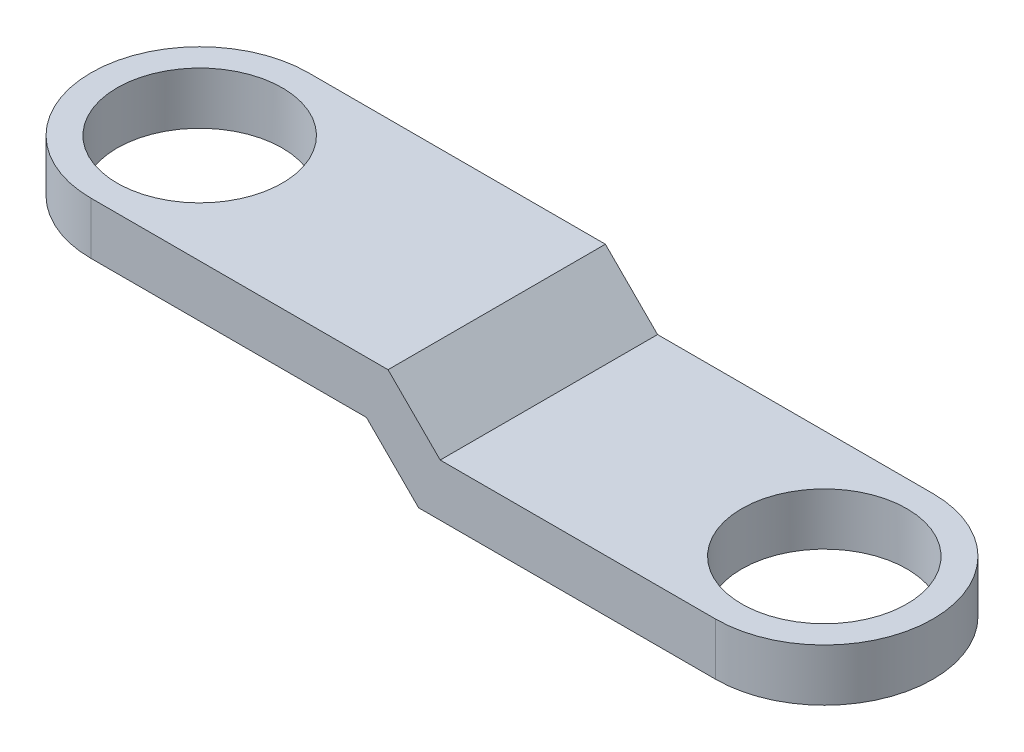
ISO-10303-21;
HEADER;
FILE_DESCRIPTION(('STEP AP214'),'2;1');
FILE_NAME('part.step','',(''),(''),'','','');
FILE_SCHEMA(('AUTOMOTIVE_DESIGN { 1 0 10303 214 1 1 1 1 }'));
ENDSEC;
DATA;
#1=APPLICATION_CONTEXT('core data for automotive mechanical design processes');
#2=APPLICATION_PROTOCOL_DEFINITION('international standard','automotive_design',2000,#1);
#3=PRODUCT_CONTEXT('',#1,'mechanical');
#4=PRODUCT('Part','Part','',(#3));
#5=PRODUCT_RELATED_PRODUCT_CATEGORY('part','',(#4));
#6=PRODUCT_DEFINITION_FORMATION('','',#4);
#7=PRODUCT_DEFINITION_CONTEXT('part definition',#1,'design');
#8=PRODUCT_DEFINITION('design','',#6,#7);
#9=PRODUCT_DEFINITION_SHAPE('','',#8);
#10=(LENGTH_UNIT() NAMED_UNIT(*) SI_UNIT(.MILLI.,.METRE.));
#11=(NAMED_UNIT(*) PLANE_ANGLE_UNIT() SI_UNIT($,.RADIAN.));
#12=(NAMED_UNIT(*) SI_UNIT($,.STERADIAN.) SOLID_ANGLE_UNIT());
#13=UNCERTAINTY_MEASURE_WITH_UNIT(LENGTH_MEASURE(1.E-05),#10,'distance_accuracy_value','');
#14=(GEOMETRIC_REPRESENTATION_CONTEXT(3) GLOBAL_UNCERTAINTY_ASSIGNED_CONTEXT((#13)) GLOBAL_UNIT_ASSIGNED_CONTEXT((#10,
#11,#12)) REPRESENTATION_CONTEXT('',''));
#15=CARTESIAN_POINT('',(0.,0.,0.));
#16=DIRECTION('',(0.,0.,1.));
#17=DIRECTION('',(1.,0.,0.));
#18=AXIS2_PLACEMENT_3D('',#15,#16,#17);
#19=CARTESIAN_POINT('',(-2.99999999999996,6.,12.5));
#20=DIRECTION('',(0.,-1.,0.));
#21=DIRECTION('',(1.,0.,0.));
#22=AXIS2_PLACEMENT_3D('',#19,#20,#21);
#23=PLANE('',#22);
#24=CARTESIAN_POINT('',(-35.9210244842766,5.99999999999999,0.));
#25=DIRECTION('',(0.,1.,0.));
#26=DIRECTION('',(-1.,0.,0.));
#27=AXIS2_PLACEMENT_3D('',#24,#25,#26);
#28=CIRCLE('',#27,9.5);
#29=CARTESIAN_POINT('',(-45.4210244842766,5.99999999999999,0.));
#30=VERTEX_POINT('',#29);
#31=EDGE_CURVE('E187',#30,#30,#28,.T.);
#32=ORIENTED_EDGE('',*,*,#31,.F.);
#33=EDGE_LOOP('',(#32));
#34=FACE_BOUND('',#33,.T.);
#35=DIRECTION('',(-1.,0.,0.));
#36=VECTOR('',#35,1.);
#37=CARTESIAN_POINT('',(-2.99999999999996,6.,-12.5));
#38=LINE('',#37,#36);
#39=CARTESIAN_POINT('',(-1.75735931288067,6.,-12.5));
#40=VERTEX_POINT('',#39);
#41=CARTESIAN_POINT('',(-35.9210244842766,5.99999999999999,-12.5));
#42=VERTEX_POINT('',#41);
#43=EDGE_CURVE('E151',#40,#42,#38,.T.);
#44=ORIENTED_EDGE('',*,*,#43,.T.);
#45=CARTESIAN_POINT('',(-35.9210244842766,5.99999999999999,0.));
#46=DIRECTION('',(0.,1.,0.));
#47=DIRECTION('',(-1.,0.,0.));
#48=AXIS2_PLACEMENT_3D('',#45,#46,#47);
#49=CIRCLE('',#48,12.5);
#50=CARTESIAN_POINT('',(-35.9210244842766,5.99999999999999,12.5));
#51=VERTEX_POINT('',#50);
#52=EDGE_CURVE('E203',#42,#51,#49,.T.);
#53=ORIENTED_EDGE('',*,*,#52,.T.);
#54=DIRECTION('',(-1.,0.,0.));
#55=VECTOR('',#54,1.);
#56=CARTESIAN_POINT('',(-2.99999999999996,6.,12.5));
#57=LINE('',#56,#55);
#58=CARTESIAN_POINT('',(-1.75735931288067,6.,12.5));
#59=VERTEX_POINT('',#58);
#60=EDGE_CURVE('E177',#59,#51,#57,.T.);
#61=ORIENTED_EDGE('',*,*,#60,.F.);
#62=DIRECTION('',(0.,0.,-1.));
#63=VECTOR('',#62,1.);
#64=CARTESIAN_POINT('',(-1.75735931288067,6.,12.5));
#65=LINE('',#64,#63);
#66=EDGE_CURVE('E150',#59,#40,#65,.T.);
#67=ORIENTED_EDGE('',*,*,#66,.T.);
#68=EDGE_LOOP('',(#44,#53,#61,#67));
#69=FACE_BOUND('',#68,.T.);
#70=ADVANCED_FACE('F39',(#34,#69),#23,.F.);
#71=CARTESIAN_POINT('',(-2.99999999999996,0.,12.5));
#72=DIRECTION('',(0.,-1.,0.));
#73=DIRECTION('',(1.,0.,0.));
#74=AXIS2_PLACEMENT_3D('',#71,#72,#73);
#75=PLANE('',#74);
#76=CARTESIAN_POINT('',(-35.9210244842766,0.,0.));
#77=DIRECTION('',(0.,-1.,0.));
#78=DIRECTION('',(1.,0.,0.));
#79=AXIS2_PLACEMENT_3D('',#76,#77,#78);
#80=CIRCLE('',#79,9.5);
#81=CARTESIAN_POINT('',(-26.4210244842766,0.,0.));
#82=VERTEX_POINT('',#81);
#83=EDGE_CURVE('E42',#82,#82,#80,.T.);
#84=ORIENTED_EDGE('',*,*,#83,.F.);
#85=EDGE_LOOP('',(#84));
#86=FACE_BOUND('',#85,.T.);
#87=DIRECTION('',(-1.,0.,0.));
#88=VECTOR('',#87,1.);
#89=CARTESIAN_POINT('',(-2.99999999999996,0.,-12.5));
#90=LINE('',#89,#88);
#91=CARTESIAN_POINT('',(-4.24264068711926,0.,-12.5));
#92=VERTEX_POINT('',#91);
#93=CARTESIAN_POINT('',(-35.9210244842766,0.,-12.5));
#94=VERTEX_POINT('',#93);
#95=EDGE_CURVE('E160',#92,#94,#90,.T.);
#96=ORIENTED_EDGE('',*,*,#95,.F.);
#97=DIRECTION('',(0.,0.,-1.));
#98=VECTOR('',#97,1.);
#99=CARTESIAN_POINT('',(-4.24264068711926,0.,12.5));
#100=LINE('',#99,#98);
#101=CARTESIAN_POINT('',(-4.24264068711926,0.,12.5));
#102=VERTEX_POINT('',#101);
#103=EDGE_CURVE('E11',#102,#92,#100,.T.);
#104=ORIENTED_EDGE('',*,*,#103,.F.);
#105=DIRECTION('',(-1.,0.,0.));
#106=VECTOR('',#105,1.);
#107=CARTESIAN_POINT('',(-2.99999999999996,0.,12.5));
#108=LINE('',#107,#106);
#109=CARTESIAN_POINT('',(-35.9210244842766,0.,12.5));
#110=VERTEX_POINT('',#109);
#111=EDGE_CURVE('E142',#102,#110,#108,.T.);
#112=ORIENTED_EDGE('',*,*,#111,.T.);
#113=CARTESIAN_POINT('',(-35.9210244842766,0.,0.));
#114=DIRECTION('',(0.,-1.,0.));
#115=DIRECTION('',(1.,0.,0.));
#116=AXIS2_PLACEMENT_3D('',#113,#114,#115);
#117=CIRCLE('',#116,12.5);
#118=EDGE_CURVE('E156',#94,#110,#117,.F.);
#119=ORIENTED_EDGE('',*,*,#118,.F.);
#120=EDGE_LOOP('',(#96,#104,#112,#119));
#121=FACE_BOUND('',#120,.T.);
#122=ADVANCED_FACE('F215',(#86,#121),#75,.T.);
#123=CARTESIAN_POINT('',(-5.12132034355962,0.878679656440368,12.5));
#124=DIRECTION('',(-0.707106781186551,-0.707106781186544,0.));
#125=DIRECTION('',(0.707106781186544,-0.707106781186551,0.));
#126=AXIS2_PLACEMENT_3D('',#123,#124,#125);
#127=PLANE('',#126);
#128=DIRECTION('',(-0.707106781186544,0.707106781186551,0.));
#129=VECTOR('',#128,1.);
#130=CARTESIAN_POINT('',(-5.12132034355962,0.878679656440368,-12.5));
#131=LINE('',#130,#129);
#132=CARTESIAN_POINT('',(1.75735931288068,-6.00000000000001,-12.5));
#133=VERTEX_POINT('',#132);
#134=EDGE_CURVE('E164',#133,#92,#131,.T.);
#135=ORIENTED_EDGE('',*,*,#134,.F.);
#136=DIRECTION('',(0.,0.,-1.));
#137=VECTOR('',#136,1.);
#138=CARTESIAN_POINT('',(1.75735931288068,-6.00000000000001,12.5));
#139=LINE('',#138,#137);
#140=CARTESIAN_POINT('',(1.75735931288068,-6.00000000000001,12.5));
#141=VERTEX_POINT('',#140);
#142=EDGE_CURVE('E49',#141,#133,#139,.T.);
#143=ORIENTED_EDGE('',*,*,#142,.F.);
#144=DIRECTION('',(-0.707106781186544,0.707106781186551,0.));
#145=VECTOR('',#144,1.);
#146=CARTESIAN_POINT('',(-5.12132034355962,0.878679656440368,12.5));
#147=LINE('',#146,#145);
#148=EDGE_CURVE('E138',#141,#102,#147,.T.);
#149=ORIENTED_EDGE('',*,*,#148,.T.);
#150=ORIENTED_EDGE('',*,*,#103,.T.);
#151=EDGE_LOOP('',(#135,#143,#149,#150));
#152=FACE_BOUND('',#151,.T.);
#153=ADVANCED_FACE('F220',(#152),#127,.T.);
#154=CARTESIAN_POINT('',(2.99999999999998,-6.00000000000001,12.5));
#155=DIRECTION('',(0.,-1.,0.));
#156=DIRECTION('',(0.,0.,-1.));
#157=AXIS2_PLACEMENT_3D('',#154,#155,#156);
#158=PLANE('',#157);
#159=CARTESIAN_POINT('',(35.9210244842766,-6.00000000000001,0.));
#160=DIRECTION('',(0.,1.,0.));
#161=DIRECTION('',(-1.,0.,0.));
#162=AXIS2_PLACEMENT_3D('',#159,#160,#161);
#163=CIRCLE('',#162,9.5);
#164=CARTESIAN_POINT('',(26.4210244842766,-6.00000000000001,0.));
#165=VERTEX_POINT('',#164);
#166=EDGE_CURVE('E194',#165,#165,#163,.T.);
#167=ORIENTED_EDGE('',*,*,#166,.T.);
#168=EDGE_LOOP('',(#167));
#169=FACE_BOUND('',#168,.T.);
#170=DIRECTION('',(1.,0.,0.));
#171=VECTOR('',#170,1.);
#172=CARTESIAN_POINT('',(2.99999999999998,-6.00000000000001,-12.5));
#173=LINE('',#172,#171);
#174=CARTESIAN_POINT('',(35.9210244842766,-6.00000000000001,-12.5));
#175=VERTEX_POINT('',#174);
#176=EDGE_CURVE('E131',#175,#133,#173,.F.);
#177=ORIENTED_EDGE('',*,*,#176,.F.);
#178=CARTESIAN_POINT('',(35.9210244842766,-6.00000000000001,0.));
#179=DIRECTION('',(0.,-1.,0.));
#180=DIRECTION('',(0.,0.,-1.));
#181=AXIS2_PLACEMENT_3D('',#178,#179,#180);
#182=CIRCLE('',#181,12.5);
#183=CARTESIAN_POINT('',(35.9210244842766,-6.00000000000001,12.5));
#184=VERTEX_POINT('',#183);
#185=EDGE_CURVE('E118',#175,#184,#182,.T.);
#186=ORIENTED_EDGE('',*,*,#185,.T.);
#187=DIRECTION('',(1.,0.,0.));
#188=VECTOR('',#187,1.);
#189=CARTESIAN_POINT('',(2.99999999999998,-6.00000000000001,12.5));
#190=LINE('',#189,#188);
#191=EDGE_CURVE('E125',#184,#141,#190,.F.);
#192=ORIENTED_EDGE('',*,*,#191,.T.);
#193=ORIENTED_EDGE('',*,*,#142,.T.);
#194=EDGE_LOOP('',(#177,#186,#192,#193));
#195=FACE_BOUND('',#194,.T.);
#196=ADVANCED_FACE('F129',(#169,#195),#158,.T.);
#197=CARTESIAN_POINT('',(2.99999999999998,0.,12.5));
#198=DIRECTION('',(0.,-1.,0.));
#199=DIRECTION('',(0.,0.,-1.));
#200=AXIS2_PLACEMENT_3D('',#197,#198,#199);
#201=PLANE('',#200);
#202=CARTESIAN_POINT('',(35.9210244842766,0.,0.));
#203=DIRECTION('',(0.,-1.,0.));
#204=DIRECTION('',(0.,0.,-1.));
#205=AXIS2_PLACEMENT_3D('',#202,#203,#204);
#206=CIRCLE('',#205,9.5);
#207=CARTESIAN_POINT('',(35.9210244842766,0.,-9.5));
#208=VERTEX_POINT('',#207);
#209=EDGE_CURVE('E184',#208,#208,#206,.T.);
#210=ORIENTED_EDGE('',*,*,#209,.T.);
#211=EDGE_LOOP('',(#210));
#212=FACE_BOUND('',#211,.T.);
#213=DIRECTION('',(1.,0.,0.));
#214=VECTOR('',#213,1.);
#215=CARTESIAN_POINT('',(2.99999999999998,0.,-12.5));
#216=LINE('',#215,#214);
#217=CARTESIAN_POINT('',(35.9210244842766,0.,-12.5));
#218=VERTEX_POINT('',#217);
#219=CARTESIAN_POINT('',(4.24264068711927,0.,-12.5));
#220=VERTEX_POINT('',#219);
#221=EDGE_CURVE('E81',#218,#220,#216,.F.);
#222=ORIENTED_EDGE('',*,*,#221,.T.);
#223=DIRECTION('',(0.,0.,-1.));
#224=VECTOR('',#223,1.);
#225=CARTESIAN_POINT('',(4.24264068711927,0.,12.5));
#226=LINE('',#225,#224);
#227=CARTESIAN_POINT('',(4.24264068711927,0.,12.5));
#228=VERTEX_POINT('',#227);
#229=EDGE_CURVE('E180',#228,#220,#226,.T.);
#230=ORIENTED_EDGE('',*,*,#229,.F.);
#231=DIRECTION('',(1.,0.,0.));
#232=VECTOR('',#231,1.);
#233=CARTESIAN_POINT('',(2.99999999999998,0.,12.5));
#234=LINE('',#233,#232);
#235=CARTESIAN_POINT('',(35.9210244842766,0.,12.5));
#236=VERTEX_POINT('',#235);
#237=EDGE_CURVE('E124',#236,#228,#234,.F.);
#238=ORIENTED_EDGE('',*,*,#237,.F.);
#239=CARTESIAN_POINT('',(35.9210244842766,0.,0.));
#240=DIRECTION('',(0.,-1.,0.));
#241=DIRECTION('',(0.,0.,-1.));
#242=AXIS2_PLACEMENT_3D('',#239,#240,#241);
#243=CIRCLE('',#242,12.5);
#244=EDGE_CURVE('E120',#236,#218,#243,.F.);
#245=ORIENTED_EDGE('',*,*,#244,.T.);
#246=EDGE_LOOP('',(#222,#230,#238,#245));
#247=FACE_BOUND('',#246,.T.);
#248=ADVANCED_FACE('F227',(#212,#247),#201,.F.);
#249=CARTESIAN_POINT('',(-0.878679656440311,5.12132034355963,12.5));
#250=DIRECTION('',(-0.707106781186551,-0.707106781186544,0.));
#251=DIRECTION('',(0.707106781186544,-0.707106781186551,0.));
#252=AXIS2_PLACEMENT_3D('',#249,#250,#251);
#253=PLANE('',#252);
#254=DIRECTION('',(-0.707106781186544,0.707106781186551,0.));
#255=VECTOR('',#254,1.);
#256=CARTESIAN_POINT('',(-0.878679656440311,5.12132034355963,-12.5));
#257=LINE('',#256,#255);
#258=EDGE_CURVE('E87',#220,#40,#257,.T.);
#259=ORIENTED_EDGE('',*,*,#258,.T.);
#260=ORIENTED_EDGE('',*,*,#66,.F.);
#261=DIRECTION('',(-0.707106781186544,0.707106781186551,0.));
#262=VECTOR('',#261,1.);
#263=CARTESIAN_POINT('',(-0.878679656440311,5.12132034355963,12.5));
#264=LINE('',#263,#262);
#265=EDGE_CURVE('E58',#228,#59,#264,.T.);
#266=ORIENTED_EDGE('',*,*,#265,.F.);
#267=ORIENTED_EDGE('',*,*,#229,.T.);
#268=EDGE_LOOP('',(#259,#260,#266,#267));
#269=FACE_BOUND('',#268,.T.);
#270=ADVANCED_FACE('F226',(#269),#253,.F.);
#271=CARTESIAN_POINT('',(0.,0.,12.5));
#272=DIRECTION('',(0.,0.,-1.));
#273=DIRECTION('',(-1.,0.,0.));
#274=AXIS2_PLACEMENT_3D('',#271,#272,#273);
#275=PLANE('',#274);
#276=ORIENTED_EDGE('',*,*,#60,.T.);
#277=DIRECTION('',(0.,1.,0.));
#278=VECTOR('',#277,1.);
#279=CARTESIAN_POINT('',(-35.9210244842766,0.,12.5));
#280=LINE('',#279,#278);
#281=EDGE_CURVE('E212',#110,#51,#280,.T.);
#282=ORIENTED_EDGE('',*,*,#281,.F.);
#283=ORIENTED_EDGE('',*,*,#111,.F.);
#284=ORIENTED_EDGE('',*,*,#148,.F.);
#285=ORIENTED_EDGE('',*,*,#191,.F.);
#286=DIRECTION('',(0.,-1.,0.));
#287=VECTOR('',#286,1.);
#288=CARTESIAN_POINT('',(35.9210244842766,0.,12.5));
#289=LINE('',#288,#287);
#290=EDGE_CURVE('E114',#236,#184,#289,.T.);
#291=ORIENTED_EDGE('',*,*,#290,.F.);
#292=ORIENTED_EDGE('',*,*,#237,.T.);
#293=ORIENTED_EDGE('',*,*,#265,.T.);
#294=EDGE_LOOP('',(#276,#282,#283,#284,#285,#291,#292,#293));
#295=FACE_BOUND('',#294,.T.);
#296=ADVANCED_FACE('F136',(#295),#275,.F.);
#297=CARTESIAN_POINT('',(0.,0.,-12.5));
#298=DIRECTION('',(0.,0.,-1.));
#299=DIRECTION('',(-1.,0.,0.));
#300=AXIS2_PLACEMENT_3D('',#297,#298,#299);
#301=PLANE('',#300);
#302=ORIENTED_EDGE('',*,*,#43,.F.);
#303=ORIENTED_EDGE('',*,*,#258,.F.);
#304=ORIENTED_EDGE('',*,*,#221,.F.);
#305=DIRECTION('',(0.,-1.,0.));
#306=VECTOR('',#305,1.);
#307=CARTESIAN_POINT('',(35.9210244842766,0.,-12.5));
#308=LINE('',#307,#306);
#309=EDGE_CURVE('E170',#218,#175,#308,.T.);
#310=ORIENTED_EDGE('',*,*,#309,.T.);
#311=ORIENTED_EDGE('',*,*,#176,.T.);
#312=ORIENTED_EDGE('',*,*,#134,.T.);
#313=ORIENTED_EDGE('',*,*,#95,.T.);
#314=DIRECTION('',(0.,1.,0.));
#315=VECTOR('',#314,1.);
#316=CARTESIAN_POINT('',(-35.9210244842766,0.,-12.5));
#317=LINE('',#316,#315);
#318=EDGE_CURVE('E155',#94,#42,#317,.T.);
#319=ORIENTED_EDGE('',*,*,#318,.T.);
#320=EDGE_LOOP('',(#302,#303,#304,#310,#311,#312,#313,#319));
#321=FACE_BOUND('',#320,.T.);
#322=ADVANCED_FACE('F223',(#321),#301,.T.);
#323=CARTESIAN_POINT('',(-35.9210244842766,-27.9508497187474,0.));
#324=DIRECTION('',(0.,1.,0.));
#325=DIRECTION('',(-1.,0.,0.));
#326=AXIS2_PLACEMENT_3D('',#323,#324,#325);
#327=CYLINDRICAL_SURFACE('',#326,12.5);
#328=ORIENTED_EDGE('',*,*,#318,.F.);
#329=ORIENTED_EDGE('',*,*,#118,.T.);
#330=ORIENTED_EDGE('',*,*,#281,.T.);
#331=ORIENTED_EDGE('',*,*,#52,.F.);
#332=EDGE_LOOP('',(#328,#329,#330,#331));
#333=FACE_BOUND('',#332,.T.);
#334=ADVANCED_FACE('F261',(#333),#327,.T.);
#335=CARTESIAN_POINT('',(35.9210244842766,27.9508497187474,0.));
#336=DIRECTION('',(0.,-1.,0.));
#337=DIRECTION('',(1.,0.,0.));
#338=AXIS2_PLACEMENT_3D('',#335,#336,#337);
#339=CYLINDRICAL_SURFACE('',#338,12.5);
#340=ORIENTED_EDGE('',*,*,#244,.F.);
#341=ORIENTED_EDGE('',*,*,#290,.T.);
#342=ORIENTED_EDGE('',*,*,#185,.F.);
#343=ORIENTED_EDGE('',*,*,#309,.F.);
#344=EDGE_LOOP('',(#340,#341,#342,#343));
#345=FACE_BOUND('',#344,.T.);
#346=ADVANCED_FACE('F116',(#345),#339,.T.);
#347=CARTESIAN_POINT('',(35.9210244842766,-6.00000000000001,0.));
#348=DIRECTION('',(0.,1.,0.));
#349=DIRECTION('',(-1.,0.,0.));
#350=AXIS2_PLACEMENT_3D('',#347,#348,#349);
#351=CYLINDRICAL_SURFACE('',#350,9.5);
#352=ORIENTED_EDGE('',*,*,#166,.F.);
#353=EDGE_LOOP('',(#352));
#354=FACE_BOUND('',#353,.T.);
#355=ORIENTED_EDGE('',*,*,#209,.F.);
#356=EDGE_LOOP('',(#355));
#357=FACE_BOUND('',#356,.T.);
#358=ADVANCED_FACE('F251',(#354,#357),#351,.F.);
#359=CARTESIAN_POINT('',(-35.9210244842766,-6.00000000000002,0.));
#360=DIRECTION('',(0.,1.,0.));
#361=DIRECTION('',(-1.,0.,0.));
#362=AXIS2_PLACEMENT_3D('',#359,#360,#361);
#363=CYLINDRICAL_SURFACE('',#362,9.5);
#364=ORIENTED_EDGE('',*,*,#83,.T.);
#365=EDGE_LOOP('',(#364));
#366=FACE_BOUND('',#365,.T.);
#367=ORIENTED_EDGE('',*,*,#31,.T.);
#368=EDGE_LOOP('',(#367));
#369=FACE_BOUND('',#368,.T.);
#370=ADVANCED_FACE('F249',(#366,#369),#363,.F.);
#371=CLOSED_SHELL('',(#70,#122,#153,#196,#248,#270,#296,#322,#334,#346,#358,#370));
#372=MANIFOLD_SOLID_BREP('B2',#371);
#373=ADVANCED_BREP_SHAPE_REPRESENTATION('',(#18,#372),#14);
#374=SHAPE_DEFINITION_REPRESENTATION(#9,#373);
ENDSEC;
END-ISO-10303-21;
